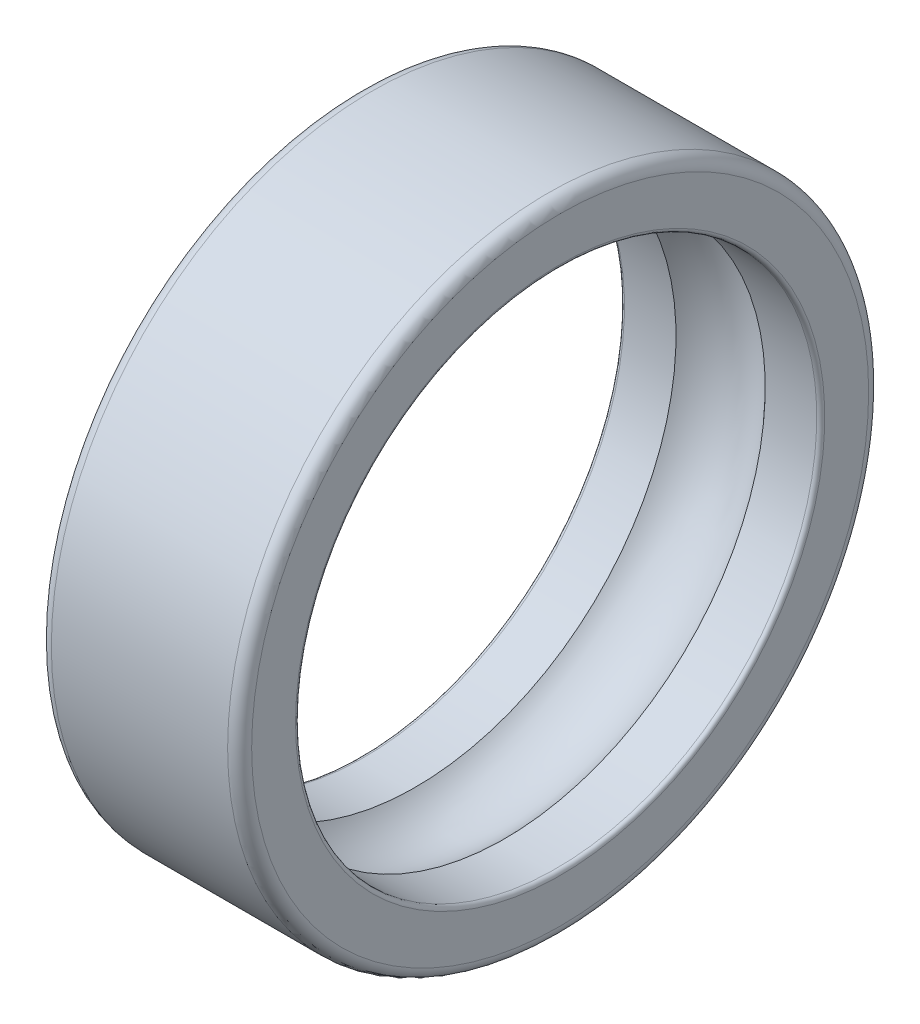
ISO-10303-21;
HEADER;
FILE_DESCRIPTION(('STEP AP214'),'2;1');
FILE_NAME('part.step','',(''),(''),'','','');
FILE_SCHEMA(('AUTOMOTIVE_DESIGN { 1 0 10303 214 1 1 1 1 }'));
ENDSEC;
DATA;
#1=APPLICATION_CONTEXT('core data for automotive mechanical design processes');
#2=APPLICATION_PROTOCOL_DEFINITION('international standard','automotive_design',2000,#1);
#3=PRODUCT_CONTEXT('',#1,'mechanical');
#4=PRODUCT('Part','Part','',(#3));
#5=PRODUCT_RELATED_PRODUCT_CATEGORY('part','',(#4));
#6=PRODUCT_DEFINITION_FORMATION('','',#4);
#7=PRODUCT_DEFINITION_CONTEXT('part definition',#1,'design');
#8=PRODUCT_DEFINITION('design','',#6,#7);
#9=PRODUCT_DEFINITION_SHAPE('','',#8);
#10=(LENGTH_UNIT() NAMED_UNIT(*) SI_UNIT(.MILLI.,.METRE.));
#11=(NAMED_UNIT(*) PLANE_ANGLE_UNIT() SI_UNIT($,.RADIAN.));
#12=(NAMED_UNIT(*) SI_UNIT($,.STERADIAN.) SOLID_ANGLE_UNIT());
#13=UNCERTAINTY_MEASURE_WITH_UNIT(LENGTH_MEASURE(1.E-05),#10,'distance_accuracy_value','');
#14=(GEOMETRIC_REPRESENTATION_CONTEXT(3) GLOBAL_UNCERTAINTY_ASSIGNED_CONTEXT((#13)) GLOBAL_UNIT_ASSIGNED_CONTEXT((#10,
#11,#12)) REPRESENTATION_CONTEXT('',''));
#15=CARTESIAN_POINT('',(0.,0.,0.));
#16=DIRECTION('',(0.,0.,1.));
#17=DIRECTION('',(1.,0.,0.));
#18=AXIS2_PLACEMENT_3D('',#15,#16,#17);
#19=CARTESIAN_POINT('',(0.599999999999878,0.,0.));
#20=DIRECTION('',(-1.,0.,0.));
#21=DIRECTION('',(0.,0.,1.));
#22=AXIS2_PLACEMENT_3D('',#19,#20,#21);
#23=TOROIDAL_SURFACE('',#22,15.4000000000001,0.599999999999878);
#24=CARTESIAN_POINT('',(0.,0.,0.));
#25=DIRECTION('',(-1.,0.,0.));
#26=DIRECTION('',(0.,0.,1.));
#27=AXIS2_PLACEMENT_3D('',#24,#25,#26);
#28=CIRCLE('',#27,15.4);
#29=CARTESIAN_POINT('',(0.,0.,15.4));
#30=VERTEX_POINT('',#29);
#31=EDGE_CURVE('E10',#30,#30,#28,.T.);
#32=ORIENTED_EDGE('',*,*,#31,.F.);
#33=EDGE_LOOP('',(#32));
#34=FACE_BOUND('',#33,.T.);
#35=CARTESIAN_POINT('',(0.600000000000003,0.,0.));
#36=DIRECTION('',(-1.,0.,0.));
#37=DIRECTION('',(0.,0.,1.));
#38=AXIS2_PLACEMENT_3D('',#35,#36,#37);
#39=CIRCLE('',#38,16.);
#40=CARTESIAN_POINT('',(0.600000000000003,0.,16.));
#41=VERTEX_POINT('',#40);
#42=EDGE_CURVE('E65',#41,#41,#39,.T.);
#43=ORIENTED_EDGE('',*,*,#42,.T.);
#44=EDGE_LOOP('',(#43));
#45=FACE_BOUND('',#44,.T.);
#46=ADVANCED_FACE('F31',(#34,#45),#23,.T.);
#47=CARTESIAN_POINT('',(0.,15.4,0.));
#48=DIRECTION('',(1.,0.,0.));
#49=DIRECTION('',(0.,0.,-1.));
#50=AXIS2_PLACEMENT_3D('',#47,#48,#49);
#51=PLANE('',#50);
#52=CARTESIAN_POINT('',(0.,0.,0.));
#53=DIRECTION('',(-1.,0.,0.));
#54=DIRECTION('',(0.,0.,1.));
#55=AXIS2_PLACEMENT_3D('',#52,#53,#54);
#56=CIRCLE('',#55,13.21);
#57=CARTESIAN_POINT('',(0.,0.,13.21));
#58=VERTEX_POINT('',#57);
#59=EDGE_CURVE('E37',#58,#58,#56,.T.);
#60=ORIENTED_EDGE('',*,*,#59,.F.);
#61=EDGE_LOOP('',(#60));
#62=FACE_BOUND('',#61,.T.);
#63=ORIENTED_EDGE('',*,*,#31,.T.);
#64=EDGE_LOOP('',(#63));
#65=FACE_BOUND('',#64,.T.);
#66=ADVANCED_FACE('F114',(#62,#65),#51,.F.);
#67=CARTESIAN_POINT('',(0.200000000000527,0.,0.));
#68=DIRECTION('',(-1.,0.,0.));
#69=DIRECTION('',(0.,0.,1.));
#70=AXIS2_PLACEMENT_3D('',#67,#68,#69);
#71=TOROIDAL_SURFACE('',#70,13.2100000000005,0.200000000000527);
#72=CARTESIAN_POINT('',(0.199999999999999,0.,0.));
#73=DIRECTION('',(-1.,0.,0.));
#74=DIRECTION('',(0.,0.,1.));
#75=AXIS2_PLACEMENT_3D('',#72,#73,#74);
#76=CIRCLE('',#75,13.01);
#77=CARTESIAN_POINT('',(0.199999999999999,0.,13.01));
#78=VERTEX_POINT('',#77);
#79=EDGE_CURVE('E41',#78,#78,#76,.T.);
#80=ORIENTED_EDGE('',*,*,#79,.F.);
#81=EDGE_LOOP('',(#80));
#82=FACE_BOUND('',#81,.T.);
#83=ORIENTED_EDGE('',*,*,#59,.T.);
#84=EDGE_LOOP('',(#83));
#85=FACE_BOUND('',#84,.T.);
#86=ADVANCED_FACE('F109',(#82,#85),#71,.T.);
#87=CARTESIAN_POINT('',(50.,0.,0.));
#88=DIRECTION('',(-1.,0.,0.));
#89=DIRECTION('',(0.,0.,1.));
#90=AXIS2_PLACEMENT_3D('',#87,#88,#89);
#91=CYLINDRICAL_SURFACE('',#90,13.01);
#92=CARTESIAN_POINT('',(2.7729167056439,0.,0.));
#93=DIRECTION('',(-1.,0.,0.));
#94=DIRECTION('',(0.,0.,1.));
#95=AXIS2_PLACEMENT_3D('',#92,#93,#94);
#96=CIRCLE('',#95,13.01);
#97=CARTESIAN_POINT('',(2.7729167056439,0.,13.01));
#98=VERTEX_POINT('',#97);
#99=EDGE_CURVE('E45',#98,#98,#96,.T.);
#100=ORIENTED_EDGE('',*,*,#99,.F.);
#101=EDGE_LOOP('',(#100));
#102=FACE_BOUND('',#101,.T.);
#103=ORIENTED_EDGE('',*,*,#79,.T.);
#104=EDGE_LOOP('',(#103));
#105=FACE_BOUND('',#104,.T.);
#106=ADVANCED_FACE('F103',(#102,#105),#91,.F.);
#107=CARTESIAN_POINT('',(5.,0.,0.));
#108=DIRECTION('',(-1.,0.,0.));
#109=DIRECTION('',(0.,0.,1.));
#110=AXIS2_PLACEMENT_3D('',#107,#108,#109);
#111=TOROIDAL_SURFACE('',#110,11.,3.00000000000001);
#112=CARTESIAN_POINT('',(7.2270832943561,0.,0.));
#113=DIRECTION('',(-1.,0.,0.));
#114=DIRECTION('',(0.,0.,1.));
#115=AXIS2_PLACEMENT_3D('',#112,#113,#114);
#116=CIRCLE('',#115,13.01);
#117=CARTESIAN_POINT('',(7.2270832943561,0.,13.01));
#118=VERTEX_POINT('',#117);
#119=EDGE_CURVE('E50',#118,#118,#116,.T.);
#120=ORIENTED_EDGE('',*,*,#119,.F.);
#121=EDGE_LOOP('',(#120));
#122=FACE_BOUND('',#121,.T.);
#123=ORIENTED_EDGE('',*,*,#99,.T.);
#124=EDGE_LOOP('',(#123));
#125=FACE_BOUND('',#124,.T.);
#126=ADVANCED_FACE('F97',(#122,#125),#111,.F.);
#127=CARTESIAN_POINT('',(50.,0.,0.));
#128=DIRECTION('',(-1.,0.,0.));
#129=DIRECTION('',(0.,0.,1.));
#130=AXIS2_PLACEMENT_3D('',#127,#128,#129);
#131=CYLINDRICAL_SURFACE('',#130,13.01);
#132=CARTESIAN_POINT('',(9.8,0.,0.));
#133=DIRECTION('',(-1.,0.,0.));
#134=DIRECTION('',(0.,0.,1.));
#135=AXIS2_PLACEMENT_3D('',#132,#133,#134);
#136=CIRCLE('',#135,13.01);
#137=CARTESIAN_POINT('',(9.8,0.,13.01));
#138=VERTEX_POINT('',#137);
#139=EDGE_CURVE('E53',#138,#138,#136,.T.);
#140=ORIENTED_EDGE('',*,*,#139,.F.);
#141=EDGE_LOOP('',(#140));
#142=FACE_BOUND('',#141,.T.);
#143=ORIENTED_EDGE('',*,*,#119,.T.);
#144=EDGE_LOOP('',(#143));
#145=FACE_BOUND('',#144,.T.);
#146=ADVANCED_FACE('F91',(#142,#145),#131,.F.);
#147=CARTESIAN_POINT('',(9.79999999999946,0.,0.));
#148=DIRECTION('',(-1.,0.,0.));
#149=DIRECTION('',(0.,0.,1.));
#150=AXIS2_PLACEMENT_3D('',#147,#148,#149);
#151=TOROIDAL_SURFACE('',#150,13.2100000000005,0.200000000000543);
#152=CARTESIAN_POINT('',(10.,0.,0.));
#153=DIRECTION('',(-1.,0.,0.));
#154=DIRECTION('',(0.,0.,1.));
#155=AXIS2_PLACEMENT_3D('',#152,#153,#154);
#156=CIRCLE('',#155,13.21);
#157=CARTESIAN_POINT('',(10.,0.,13.21));
#158=VERTEX_POINT('',#157);
#159=EDGE_CURVE('E56',#158,#158,#156,.T.);
#160=ORIENTED_EDGE('',*,*,#159,.F.);
#161=EDGE_LOOP('',(#160));
#162=FACE_BOUND('',#161,.T.);
#163=ORIENTED_EDGE('',*,*,#139,.T.);
#164=EDGE_LOOP('',(#163));
#165=FACE_BOUND('',#164,.T.);
#166=ADVANCED_FACE('F85',(#162,#165),#151,.T.);
#167=CARTESIAN_POINT('',(10.,13.21,0.));
#168=DIRECTION('',(-1.,0.,0.));
#169=DIRECTION('',(0.,0.,1.));
#170=AXIS2_PLACEMENT_3D('',#167,#168,#169);
#171=PLANE('',#170);
#172=CARTESIAN_POINT('',(10.,0.,0.));
#173=DIRECTION('',(-1.,0.,0.));
#174=DIRECTION('',(0.,0.,1.));
#175=AXIS2_PLACEMENT_3D('',#172,#173,#174);
#176=CIRCLE('',#175,15.4);
#177=CARTESIAN_POINT('',(10.,0.,15.4));
#178=VERTEX_POINT('',#177);
#179=EDGE_CURVE('E59',#178,#178,#176,.T.);
#180=ORIENTED_EDGE('',*,*,#179,.F.);
#181=EDGE_LOOP('',(#180));
#182=FACE_BOUND('',#181,.T.);
#183=ORIENTED_EDGE('',*,*,#159,.T.);
#184=EDGE_LOOP('',(#183));
#185=FACE_BOUND('',#184,.T.);
#186=ADVANCED_FACE('F79',(#182,#185),#171,.F.);
#187=CARTESIAN_POINT('',(9.40000000000007,0.,0.));
#188=DIRECTION('',(-1.,0.,0.));
#189=DIRECTION('',(0.,0.,1.));
#190=AXIS2_PLACEMENT_3D('',#187,#188,#189);
#191=TOROIDAL_SURFACE('',#190,15.4000000000001,0.599999999999929);
#192=CARTESIAN_POINT('',(9.4,0.,0.));
#193=DIRECTION('',(-1.,0.,0.));
#194=DIRECTION('',(0.,0.,1.));
#195=AXIS2_PLACEMENT_3D('',#192,#193,#194);
#196=CIRCLE('',#195,16.);
#197=CARTESIAN_POINT('',(9.4,0.,16.));
#198=VERTEX_POINT('',#197);
#199=EDGE_CURVE('E62',#198,#198,#196,.T.);
#200=ORIENTED_EDGE('',*,*,#199,.F.);
#201=EDGE_LOOP('',(#200));
#202=FACE_BOUND('',#201,.T.);
#203=ORIENTED_EDGE('',*,*,#179,.T.);
#204=EDGE_LOOP('',(#203));
#205=FACE_BOUND('',#204,.T.);
#206=ADVANCED_FACE('F73',(#202,#205),#191,.T.);
#207=CARTESIAN_POINT('',(50.,0.,0.));
#208=DIRECTION('',(-1.,0.,0.));
#209=DIRECTION('',(0.,0.,1.));
#210=AXIS2_PLACEMENT_3D('',#207,#208,#209);
#211=CYLINDRICAL_SURFACE('',#210,16.);
#212=ORIENTED_EDGE('',*,*,#42,.F.);
#213=EDGE_LOOP('',(#212));
#214=FACE_BOUND('',#213,.T.);
#215=ORIENTED_EDGE('',*,*,#199,.T.);
#216=EDGE_LOOP('',(#215));
#217=FACE_BOUND('',#216,.T.);
#218=ADVANCED_FACE('F70',(#214,#217),#211,.T.);
#219=CLOSED_SHELL('',(#46,#66,#86,#106,#126,#146,#166,#186,#206,#218));
#220=MANIFOLD_SOLID_BREP('B2',#219);
#221=ADVANCED_BREP_SHAPE_REPRESENTATION('',(#18,#220),#14);
#222=SHAPE_DEFINITION_REPRESENTATION(#9,#221);
ENDSEC;
END-ISO-10303-21;
